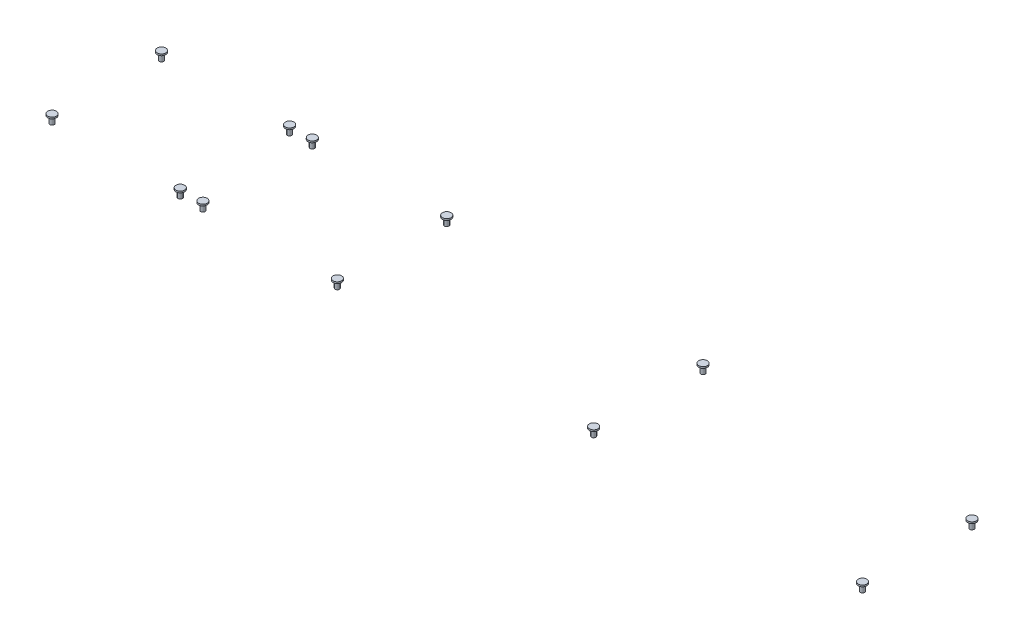
ISO-10303-21;
HEADER;
FILE_DESCRIPTION(('STEP AP214'),'2;1');
FILE_NAME('part.step','',(''),(''),'','','');
FILE_SCHEMA(('AUTOMOTIVE_DESIGN { 1 0 10303 214 1 1 1 1 }'));
ENDSEC;
DATA;
#1=APPLICATION_CONTEXT('core data for automotive mechanical design processes');
#2=APPLICATION_PROTOCOL_DEFINITION('international standard','automotive_design',2000,#1);
#3=PRODUCT_CONTEXT('',#1,'mechanical');
#4=PRODUCT('Part','Part','',(#3));
#5=PRODUCT_RELATED_PRODUCT_CATEGORY('part','',(#4));
#6=PRODUCT_DEFINITION_FORMATION('','',#4);
#7=PRODUCT_DEFINITION_CONTEXT('part definition',#1,'design');
#8=PRODUCT_DEFINITION('design','',#6,#7);
#9=PRODUCT_DEFINITION_SHAPE('','',#8);
#10=(LENGTH_UNIT() NAMED_UNIT(*) SI_UNIT(.MILLI.,.METRE.));
#11=(NAMED_UNIT(*) PLANE_ANGLE_UNIT() SI_UNIT($,.RADIAN.));
#12=(NAMED_UNIT(*) SI_UNIT($,.STERADIAN.) SOLID_ANGLE_UNIT());
#13=UNCERTAINTY_MEASURE_WITH_UNIT(LENGTH_MEASURE(1.E-05),#10,'distance_accuracy_value','');
#14=(GEOMETRIC_REPRESENTATION_CONTEXT(3) GLOBAL_UNCERTAINTY_ASSIGNED_CONTEXT((#13)) GLOBAL_UNIT_ASSIGNED_CONTEXT((#10,
#11,#12)) REPRESENTATION_CONTEXT('',''));
#15=CARTESIAN_POINT('',(0.,0.,0.));
#16=DIRECTION('',(0.,0.,1.));
#17=DIRECTION('',(1.,0.,0.));
#18=AXIS2_PLACEMENT_3D('',#15,#16,#17);
#19=CARTESIAN_POINT('',(-259.5,207.8,20.));
#20=DIRECTION('',(0.,-1.,0.));
#21=DIRECTION('',(0.,0.,-1.));
#22=AXIS2_PLACEMENT_3D('',#19,#20,#21);
#23=PLANE('',#22);
#24=CARTESIAN_POINT('',(-259.5,207.8,20.));
#25=DIRECTION('',(0.,1.,0.));
#26=DIRECTION('',(0.,0.,1.));
#27=AXIS2_PLACEMENT_3D('',#24,#25,#26);
#28=CIRCLE('',#27,1.4);
#29=CARTESIAN_POINT('',(-259.5,207.8,21.4));
#30=VERTEX_POINT('',#29);
#31=EDGE_CURVE('P0_E23',#30,#30,#28,.T.);
#32=ORIENTED_EDGE('',*,*,#31,.F.);
#33=EDGE_LOOP('',(#32));
#34=FACE_BOUND('',#33,.T.);
#35=ADVANCED_FACE('P0_F15',(#34),#23,.T.);
#36=CARTESIAN_POINT('',(-259.5,207.8,20.));
#37=DIRECTION('',(0.,1.,0.));
#38=DIRECTION('',(0.,0.,1.));
#39=AXIS2_PLACEMENT_3D('',#36,#37,#38);
#40=CYLINDRICAL_SURFACE('',#39,1.4);
#41=CARTESIAN_POINT('',(-259.5,212.2,20.));
#42=DIRECTION('',(0.,-1.,0.));
#43=DIRECTION('',(0.,0.,-1.));
#44=AXIS2_PLACEMENT_3D('',#41,#42,#43);
#45=CIRCLE('',#44,1.4);
#46=CARTESIAN_POINT('',(-259.5,212.2,18.6));
#47=VERTEX_POINT('',#46);
#48=EDGE_CURVE('P0_E10',#47,#47,#45,.F.);
#49=ORIENTED_EDGE('',*,*,#48,.F.);
#50=EDGE_LOOP('',(#49));
#51=FACE_BOUND('',#50,.T.);
#52=ORIENTED_EDGE('',*,*,#31,.T.);
#53=EDGE_LOOP('',(#52));
#54=FACE_BOUND('',#53,.T.);
#55=ADVANCED_FACE('P0_F17',(#51,#54),#40,.T.);
#56=CARTESIAN_POINT('',(-259.5,212.2,20.));
#57=DIRECTION('',(0.,-1.,0.));
#58=DIRECTION('',(0.,0.,-1.));
#59=AXIS2_PLACEMENT_3D('',#56,#57,#58);
#60=PLANE('',#59);
#61=ORIENTED_EDGE('',*,*,#48,.T.);
#62=EDGE_LOOP('',(#61));
#63=FACE_BOUND('',#62,.T.);
#64=CARTESIAN_POINT('',(-259.5,212.2,20.));
#65=DIRECTION('',(0.,1.,0.));
#66=DIRECTION('',(0.,0.,1.));
#67=AXIS2_PLACEMENT_3D('',#64,#65,#66);
#68=CIRCLE('',#67,2.75);
#69=CARTESIAN_POINT('',(-259.5,212.2,22.75));
#70=VERTEX_POINT('',#69);
#71=EDGE_CURVE('P0_E35',#70,#70,#68,.T.);
#72=ORIENTED_EDGE('',*,*,#71,.F.);
#73=EDGE_LOOP('',(#72));
#74=FACE_BOUND('',#73,.T.);
#75=ADVANCED_FACE('P0_F43',(#63,#74),#60,.T.);
#76=CARTESIAN_POINT('',(-259.5,212.2,20.));
#77=DIRECTION('',(0.,1.,0.));
#78=DIRECTION('',(0.,0.,1.));
#79=AXIS2_PLACEMENT_3D('',#76,#77,#78);
#80=CYLINDRICAL_SURFACE('',#79,2.75);
#81=CARTESIAN_POINT('',(-259.5,213.2,20.));
#82=DIRECTION('',(0.,-1.,0.));
#83=DIRECTION('',(0.,0.,-1.));
#84=AXIS2_PLACEMENT_3D('',#81,#82,#83);
#85=CIRCLE('',#84,2.75);
#86=CARTESIAN_POINT('',(-259.5,213.2,17.25));
#87=VERTEX_POINT('',#86);
#88=EDGE_CURVE('P0_E30',#87,#87,#85,.T.);
#89=ORIENTED_EDGE('',*,*,#88,.T.);
#90=EDGE_LOOP('',(#89));
#91=FACE_BOUND('',#90,.T.);
#92=ORIENTED_EDGE('',*,*,#71,.T.);
#93=EDGE_LOOP('',(#92));
#94=FACE_BOUND('',#93,.T.);
#95=ADVANCED_FACE('P0_F41',(#91,#94),#80,.T.);
#96=CARTESIAN_POINT('',(-259.5,213.2,20.));
#97=DIRECTION('',(0.,1.,0.));
#98=DIRECTION('',(0.,0.,1.));
#99=AXIS2_PLACEMENT_3D('',#96,#97,#98);
#100=PLANE('',#99);
#101=ORIENTED_EDGE('',*,*,#88,.F.);
#102=EDGE_LOOP('',(#101));
#103=FACE_BOUND('',#102,.T.);
#104=ADVANCED_FACE('P0_F50',(#103),#100,.T.);
#105=CLOSED_SHELL('',(#35,#55,#75,#95,#104));
#106=MANIFOLD_SOLID_BREP('P0_B1',#105);
#107=CARTESIAN_POINT('',(87.,207.8,90.));
#108=DIRECTION('',(0.,-1.,0.));
#109=DIRECTION('',(0.,0.,-1.));
#110=AXIS2_PLACEMENT_3D('',#107,#108,#109);
#111=PLANE('',#110);
#112=CARTESIAN_POINT('',(87.,207.8,90.));
#113=DIRECTION('',(0.,1.,0.));
#114=DIRECTION('',(0.,0.,1.));
#115=AXIS2_PLACEMENT_3D('',#112,#113,#114);
#116=CIRCLE('',#115,1.4);
#117=CARTESIAN_POINT('',(87.,207.8,91.4));
#118=VERTEX_POINT('',#117);
#119=EDGE_CURVE('P1_E23',#118,#118,#116,.T.);
#120=ORIENTED_EDGE('',*,*,#119,.F.);
#121=EDGE_LOOP('',(#120));
#122=FACE_BOUND('',#121,.T.);
#123=ADVANCED_FACE('P1_F15',(#122),#111,.T.);
#124=CARTESIAN_POINT('',(87.,207.8,90.));
#125=DIRECTION('',(0.,1.,0.));
#126=DIRECTION('',(0.,0.,1.));
#127=AXIS2_PLACEMENT_3D('',#124,#125,#126);
#128=CYLINDRICAL_SURFACE('',#127,1.4);
#129=CARTESIAN_POINT('',(87.,212.2,90.));
#130=DIRECTION('',(0.,-1.,0.));
#131=DIRECTION('',(0.,0.,-1.));
#132=AXIS2_PLACEMENT_3D('',#129,#130,#131);
#133=CIRCLE('',#132,1.4);
#134=CARTESIAN_POINT('',(87.,212.2,88.6));
#135=VERTEX_POINT('',#134);
#136=EDGE_CURVE('P1_E10',#135,#135,#133,.F.);
#137=ORIENTED_EDGE('',*,*,#136,.F.);
#138=EDGE_LOOP('',(#137));
#139=FACE_BOUND('',#138,.T.);
#140=ORIENTED_EDGE('',*,*,#119,.T.);
#141=EDGE_LOOP('',(#140));
#142=FACE_BOUND('',#141,.T.);
#143=ADVANCED_FACE('P1_F17',(#139,#142),#128,.T.);
#144=CARTESIAN_POINT('',(87.,212.2,90.));
#145=DIRECTION('',(0.,-1.,0.));
#146=DIRECTION('',(0.,0.,-1.));
#147=AXIS2_PLACEMENT_3D('',#144,#145,#146);
#148=PLANE('',#147);
#149=ORIENTED_EDGE('',*,*,#136,.T.);
#150=EDGE_LOOP('',(#149));
#151=FACE_BOUND('',#150,.T.);
#152=CARTESIAN_POINT('',(87.,212.2,90.));
#153=DIRECTION('',(0.,1.,0.));
#154=DIRECTION('',(0.,0.,1.));
#155=AXIS2_PLACEMENT_3D('',#152,#153,#154);
#156=CIRCLE('',#155,2.75);
#157=CARTESIAN_POINT('',(87.,212.2,92.75));
#158=VERTEX_POINT('',#157);
#159=EDGE_CURVE('P1_E35',#158,#158,#156,.T.);
#160=ORIENTED_EDGE('',*,*,#159,.F.);
#161=EDGE_LOOP('',(#160));
#162=FACE_BOUND('',#161,.T.);
#163=ADVANCED_FACE('P1_F43',(#151,#162),#148,.T.);
#164=CARTESIAN_POINT('',(87.,212.2,90.));
#165=DIRECTION('',(0.,1.,0.));
#166=DIRECTION('',(0.,0.,1.));
#167=AXIS2_PLACEMENT_3D('',#164,#165,#166);
#168=CYLINDRICAL_SURFACE('',#167,2.75);
#169=CARTESIAN_POINT('',(87.,213.2,90.));
#170=DIRECTION('',(0.,-1.,0.));
#171=DIRECTION('',(0.,0.,-1.));
#172=AXIS2_PLACEMENT_3D('',#169,#170,#171);
#173=CIRCLE('',#172,2.75);
#174=CARTESIAN_POINT('',(87.,213.2,87.25));
#175=VERTEX_POINT('',#174);
#176=EDGE_CURVE('P1_E31',#175,#175,#173,.T.);
#177=ORIENTED_EDGE('',*,*,#176,.T.);
#178=EDGE_LOOP('',(#177));
#179=FACE_BOUND('',#178,.T.);
#180=ORIENTED_EDGE('',*,*,#159,.T.);
#181=EDGE_LOOP('',(#180));
#182=FACE_BOUND('',#181,.T.);
#183=ADVANCED_FACE('P1_F41',(#179,#182),#168,.T.);
#184=CARTESIAN_POINT('',(87.,213.2,90.));
#185=DIRECTION('',(0.,1.,0.));
#186=DIRECTION('',(0.,0.,1.));
#187=AXIS2_PLACEMENT_3D('',#184,#185,#186);
#188=PLANE('',#187);
#189=ORIENTED_EDGE('',*,*,#176,.F.);
#190=EDGE_LOOP('',(#189));
#191=FACE_BOUND('',#190,.T.);
#192=ADVANCED_FACE('P1_F50',(#191),#188,.T.);
#193=CLOSED_SHELL('',(#123,#143,#163,#183,#192));
#194=MANIFOLD_SOLID_BREP('P1_B1',#193);
#195=CARTESIAN_POINT('',(259.,207.8,20.));
#196=DIRECTION('',(0.,-1.,0.));
#197=DIRECTION('',(0.,0.,-1.));
#198=AXIS2_PLACEMENT_3D('',#195,#196,#197);
#199=PLANE('',#198);
#200=CARTESIAN_POINT('',(259.,207.8,20.));
#201=DIRECTION('',(0.,1.,0.));
#202=DIRECTION('',(0.,0.,1.));
#203=AXIS2_PLACEMENT_3D('',#200,#201,#202);
#204=CIRCLE('',#203,1.4);
#205=CARTESIAN_POINT('',(259.,207.8,21.4));
#206=VERTEX_POINT('',#205);
#207=EDGE_CURVE('P2_E23',#206,#206,#204,.T.);
#208=ORIENTED_EDGE('',*,*,#207,.F.);
#209=EDGE_LOOP('',(#208));
#210=FACE_BOUND('',#209,.T.);
#211=ADVANCED_FACE('P2_F15',(#210),#199,.T.);
#212=CARTESIAN_POINT('',(259.,207.8,20.));
#213=DIRECTION('',(0.,1.,0.));
#214=DIRECTION('',(0.,0.,1.));
#215=AXIS2_PLACEMENT_3D('',#212,#213,#214);
#216=CYLINDRICAL_SURFACE('',#215,1.4);
#217=CARTESIAN_POINT('',(259.,212.2,20.));
#218=DIRECTION('',(0.,-1.,0.));
#219=DIRECTION('',(0.,0.,-1.));
#220=AXIS2_PLACEMENT_3D('',#217,#218,#219);
#221=CIRCLE('',#220,1.4);
#222=CARTESIAN_POINT('',(259.,212.2,18.6));
#223=VERTEX_POINT('',#222);
#224=EDGE_CURVE('P2_E10',#223,#223,#221,.F.);
#225=ORIENTED_EDGE('',*,*,#224,.F.);
#226=EDGE_LOOP('',(#225));
#227=FACE_BOUND('',#226,.T.);
#228=ORIENTED_EDGE('',*,*,#207,.T.);
#229=EDGE_LOOP('',(#228));
#230=FACE_BOUND('',#229,.T.);
#231=ADVANCED_FACE('P2_F17',(#227,#230),#216,.T.);
#232=CARTESIAN_POINT('',(259.,212.2,20.));
#233=DIRECTION('',(0.,-1.,0.));
#234=DIRECTION('',(0.,0.,-1.));
#235=AXIS2_PLACEMENT_3D('',#232,#233,#234);
#236=PLANE('',#235);
#237=ORIENTED_EDGE('',*,*,#224,.T.);
#238=EDGE_LOOP('',(#237));
#239=FACE_BOUND('',#238,.T.);
#240=CARTESIAN_POINT('',(259.,212.2,20.));
#241=DIRECTION('',(0.,1.,0.));
#242=DIRECTION('',(0.,0.,1.));
#243=AXIS2_PLACEMENT_3D('',#240,#241,#242);
#244=CIRCLE('',#243,2.75);
#245=CARTESIAN_POINT('',(259.,212.2,22.75));
#246=VERTEX_POINT('',#245);
#247=EDGE_CURVE('P2_E35',#246,#246,#244,.T.);
#248=ORIENTED_EDGE('',*,*,#247,.F.);
#249=EDGE_LOOP('',(#248));
#250=FACE_BOUND('',#249,.T.);
#251=ADVANCED_FACE('P2_F43',(#239,#250),#236,.T.);
#252=CARTESIAN_POINT('',(259.,212.2,20.));
#253=DIRECTION('',(0.,1.,0.));
#254=DIRECTION('',(0.,0.,1.));
#255=AXIS2_PLACEMENT_3D('',#252,#253,#254);
#256=CYLINDRICAL_SURFACE('',#255,2.75);
#257=CARTESIAN_POINT('',(259.,213.2,20.));
#258=DIRECTION('',(0.,-1.,0.));
#259=DIRECTION('',(0.,0.,-1.));
#260=AXIS2_PLACEMENT_3D('',#257,#258,#259);
#261=CIRCLE('',#260,2.75);
#262=CARTESIAN_POINT('',(259.,213.2,17.25));
#263=VERTEX_POINT('',#262);
#264=EDGE_CURVE('P2_E31',#263,#263,#261,.T.);
#265=ORIENTED_EDGE('',*,*,#264,.T.);
#266=EDGE_LOOP('',(#265));
#267=FACE_BOUND('',#266,.T.);
#268=ORIENTED_EDGE('',*,*,#247,.T.);
#269=EDGE_LOOP('',(#268));
#270=FACE_BOUND('',#269,.T.);
#271=ADVANCED_FACE('P2_F41',(#267,#270),#256,.T.);
#272=CARTESIAN_POINT('',(259.,213.2,20.));
#273=DIRECTION('',(0.,1.,0.));
#274=DIRECTION('',(0.,0.,1.));
#275=AXIS2_PLACEMENT_3D('',#272,#273,#274);
#276=PLANE('',#275);
#277=ORIENTED_EDGE('',*,*,#264,.F.);
#278=EDGE_LOOP('',(#277));
#279=FACE_BOUND('',#278,.T.);
#280=ADVANCED_FACE('P2_F50',(#279),#276,.T.);
#281=CLOSED_SHELL('',(#211,#231,#251,#271,#280));
#282=MANIFOLD_SOLID_BREP('P2_B1',#281);
#283=CARTESIAN_POINT('',(259.,207.8,90.));
#284=DIRECTION('',(0.,-1.,0.));
#285=DIRECTION('',(0.,0.,-1.));
#286=AXIS2_PLACEMENT_3D('',#283,#284,#285);
#287=PLANE('',#286);
#288=CARTESIAN_POINT('',(259.,207.8,90.));
#289=DIRECTION('',(0.,1.,0.));
#290=DIRECTION('',(0.,0.,1.));
#291=AXIS2_PLACEMENT_3D('',#288,#289,#290);
#292=CIRCLE('',#291,1.4);
#293=CARTESIAN_POINT('',(259.,207.8,91.4));
#294=VERTEX_POINT('',#293);
#295=EDGE_CURVE('P3_E23',#294,#294,#292,.T.);
#296=ORIENTED_EDGE('',*,*,#295,.F.);
#297=EDGE_LOOP('',(#296));
#298=FACE_BOUND('',#297,.T.);
#299=ADVANCED_FACE('P3_F15',(#298),#287,.T.);
#300=CARTESIAN_POINT('',(259.,207.8,90.));
#301=DIRECTION('',(0.,1.,0.));
#302=DIRECTION('',(0.,0.,1.));
#303=AXIS2_PLACEMENT_3D('',#300,#301,#302);
#304=CYLINDRICAL_SURFACE('',#303,1.4);
#305=CARTESIAN_POINT('',(259.,212.2,90.));
#306=DIRECTION('',(0.,-1.,0.));
#307=DIRECTION('',(0.,0.,-1.));
#308=AXIS2_PLACEMENT_3D('',#305,#306,#307);
#309=CIRCLE('',#308,1.4);
#310=CARTESIAN_POINT('',(259.,212.2,88.6));
#311=VERTEX_POINT('',#310);
#312=EDGE_CURVE('P3_E10',#311,#311,#309,.F.);
#313=ORIENTED_EDGE('',*,*,#312,.F.);
#314=EDGE_LOOP('',(#313));
#315=FACE_BOUND('',#314,.T.);
#316=ORIENTED_EDGE('',*,*,#295,.T.);
#317=EDGE_LOOP('',(#316));
#318=FACE_BOUND('',#317,.T.);
#319=ADVANCED_FACE('P3_F17',(#315,#318),#304,.T.);
#320=CARTESIAN_POINT('',(259.,212.2,90.));
#321=DIRECTION('',(0.,-1.,0.));
#322=DIRECTION('',(0.,0.,-1.));
#323=AXIS2_PLACEMENT_3D('',#320,#321,#322);
#324=PLANE('',#323);
#325=ORIENTED_EDGE('',*,*,#312,.T.);
#326=EDGE_LOOP('',(#325));
#327=FACE_BOUND('',#326,.T.);
#328=CARTESIAN_POINT('',(259.,212.2,90.));
#329=DIRECTION('',(0.,1.,0.));
#330=DIRECTION('',(0.,0.,1.));
#331=AXIS2_PLACEMENT_3D('',#328,#329,#330);
#332=CIRCLE('',#331,2.75);
#333=CARTESIAN_POINT('',(259.,212.2,92.75));
#334=VERTEX_POINT('',#333);
#335=EDGE_CURVE('P3_E35',#334,#334,#332,.T.);
#336=ORIENTED_EDGE('',*,*,#335,.F.);
#337=EDGE_LOOP('',(#336));
#338=FACE_BOUND('',#337,.T.);
#339=ADVANCED_FACE('P3_F43',(#327,#338),#324,.T.);
#340=CARTESIAN_POINT('',(259.,212.2,90.));
#341=DIRECTION('',(0.,1.,0.));
#342=DIRECTION('',(0.,0.,1.));
#343=AXIS2_PLACEMENT_3D('',#340,#341,#342);
#344=CYLINDRICAL_SURFACE('',#343,2.75);
#345=CARTESIAN_POINT('',(259.,213.2,90.));
#346=DIRECTION('',(0.,-1.,0.));
#347=DIRECTION('',(0.,0.,-1.));
#348=AXIS2_PLACEMENT_3D('',#345,#346,#347);
#349=CIRCLE('',#348,2.75);
#350=CARTESIAN_POINT('',(259.,213.2,87.25));
#351=VERTEX_POINT('',#350);
#352=EDGE_CURVE('P3_E31',#351,#351,#349,.T.);
#353=ORIENTED_EDGE('',*,*,#352,.T.);
#354=EDGE_LOOP('',(#353));
#355=FACE_BOUND('',#354,.T.);
#356=ORIENTED_EDGE('',*,*,#335,.T.);
#357=EDGE_LOOP('',(#356));
#358=FACE_BOUND('',#357,.T.);
#359=ADVANCED_FACE('P3_F41',(#355,#358),#344,.T.);
#360=CARTESIAN_POINT('',(259.,213.2,90.));
#361=DIRECTION('',(0.,1.,0.));
#362=DIRECTION('',(0.,0.,1.));
#363=AXIS2_PLACEMENT_3D('',#360,#361,#362);
#364=PLANE('',#363);
#365=ORIENTED_EDGE('',*,*,#352,.F.);
#366=EDGE_LOOP('',(#365));
#367=FACE_BOUND('',#366,.T.);
#368=ADVANCED_FACE('P3_F50',(#367),#364,.T.);
#369=CLOSED_SHELL('',(#299,#319,#339,#359,#368));
#370=MANIFOLD_SOLID_BREP('P3_B1',#369);
#371=CARTESIAN_POINT('',(-259.5,207.8,90.));
#372=DIRECTION('',(0.,-1.,0.));
#373=DIRECTION('',(0.,0.,-1.));
#374=AXIS2_PLACEMENT_3D('',#371,#372,#373);
#375=PLANE('',#374);
#376=CARTESIAN_POINT('',(-259.5,207.8,90.));
#377=DIRECTION('',(0.,1.,0.));
#378=DIRECTION('',(0.,0.,1.));
#379=AXIS2_PLACEMENT_3D('',#376,#377,#378);
#380=CIRCLE('',#379,1.4);
#381=CARTESIAN_POINT('',(-259.5,207.8,91.4));
#382=VERTEX_POINT('',#381);
#383=EDGE_CURVE('P4_E23',#382,#382,#380,.T.);
#384=ORIENTED_EDGE('',*,*,#383,.F.);
#385=EDGE_LOOP('',(#384));
#386=FACE_BOUND('',#385,.T.);
#387=ADVANCED_FACE('P4_F15',(#386),#375,.T.);
#388=CARTESIAN_POINT('',(-259.5,207.8,90.));
#389=DIRECTION('',(0.,1.,0.));
#390=DIRECTION('',(0.,0.,1.));
#391=AXIS2_PLACEMENT_3D('',#388,#389,#390);
#392=CYLINDRICAL_SURFACE('',#391,1.4);
#393=CARTESIAN_POINT('',(-259.5,212.2,90.));
#394=DIRECTION('',(0.,-1.,0.));
#395=DIRECTION('',(0.,0.,-1.));
#396=AXIS2_PLACEMENT_3D('',#393,#394,#395);
#397=CIRCLE('',#396,1.4);
#398=CARTESIAN_POINT('',(-259.5,212.2,88.6));
#399=VERTEX_POINT('',#398);
#400=EDGE_CURVE('P4_E10',#399,#399,#397,.F.);
#401=ORIENTED_EDGE('',*,*,#400,.F.);
#402=EDGE_LOOP('',(#401));
#403=FACE_BOUND('',#402,.T.);
#404=ORIENTED_EDGE('',*,*,#383,.T.);
#405=EDGE_LOOP('',(#404));
#406=FACE_BOUND('',#405,.T.);
#407=ADVANCED_FACE('P4_F17',(#403,#406),#392,.T.);
#408=CARTESIAN_POINT('',(-259.5,212.2,90.));
#409=DIRECTION('',(0.,-1.,0.));
#410=DIRECTION('',(0.,0.,-1.));
#411=AXIS2_PLACEMENT_3D('',#408,#409,#410);
#412=PLANE('',#411);
#413=ORIENTED_EDGE('',*,*,#400,.T.);
#414=EDGE_LOOP('',(#413));
#415=FACE_BOUND('',#414,.T.);
#416=CARTESIAN_POINT('',(-259.5,212.2,90.));
#417=DIRECTION('',(0.,1.,0.));
#418=DIRECTION('',(0.,0.,1.));
#419=AXIS2_PLACEMENT_3D('',#416,#417,#418);
#420=CIRCLE('',#419,2.75);
#421=CARTESIAN_POINT('',(-259.5,212.2,92.75));
#422=VERTEX_POINT('',#421);
#423=EDGE_CURVE('P4_E35',#422,#422,#420,.T.);
#424=ORIENTED_EDGE('',*,*,#423,.F.);
#425=EDGE_LOOP('',(#424));
#426=FACE_BOUND('',#425,.T.);
#427=ADVANCED_FACE('P4_F43',(#415,#426),#412,.T.);
#428=CARTESIAN_POINT('',(-259.5,212.2,90.));
#429=DIRECTION('',(0.,1.,0.));
#430=DIRECTION('',(0.,0.,1.));
#431=AXIS2_PLACEMENT_3D('',#428,#429,#430);
#432=CYLINDRICAL_SURFACE('',#431,2.75);
#433=CARTESIAN_POINT('',(-259.5,213.2,90.));
#434=DIRECTION('',(0.,-1.,0.));
#435=DIRECTION('',(0.,0.,-1.));
#436=AXIS2_PLACEMENT_3D('',#433,#434,#435);
#437=CIRCLE('',#436,2.75);
#438=CARTESIAN_POINT('',(-259.5,213.2,87.25));
#439=VERTEX_POINT('',#438);
#440=EDGE_CURVE('P4_E30',#439,#439,#437,.T.);
#441=ORIENTED_EDGE('',*,*,#440,.T.);
#442=EDGE_LOOP('',(#441));
#443=FACE_BOUND('',#442,.T.);
#444=ORIENTED_EDGE('',*,*,#423,.T.);
#445=EDGE_LOOP('',(#444));
#446=FACE_BOUND('',#445,.T.);
#447=ADVANCED_FACE('P4_F41',(#443,#446),#432,.T.);
#448=CARTESIAN_POINT('',(-259.5,213.2,90.));
#449=DIRECTION('',(0.,1.,0.));
#450=DIRECTION('',(0.,0.,1.));
#451=AXIS2_PLACEMENT_3D('',#448,#449,#450);
#452=PLANE('',#451);
#453=ORIENTED_EDGE('',*,*,#440,.F.);
#454=EDGE_LOOP('',(#453));
#455=FACE_BOUND('',#454,.T.);
#456=ADVANCED_FACE('P4_F50',(#455),#452,.T.);
#457=CLOSED_SHELL('',(#387,#407,#427,#447,#456));
#458=MANIFOLD_SOLID_BREP('P4_B1',#457);
#459=CARTESIAN_POINT('',(-177.5,207.8,20.));
#460=DIRECTION('',(0.,-1.,0.));
#461=DIRECTION('',(0.,0.,-1.));
#462=AXIS2_PLACEMENT_3D('',#459,#460,#461);
#463=PLANE('',#462);
#464=CARTESIAN_POINT('',(-177.5,207.8,20.));
#465=DIRECTION('',(0.,1.,0.));
#466=DIRECTION('',(0.,0.,1.));
#467=AXIS2_PLACEMENT_3D('',#464,#465,#466);
#468=CIRCLE('',#467,1.4);
#469=CARTESIAN_POINT('',(-177.5,207.8,21.4));
#470=VERTEX_POINT('',#469);
#471=EDGE_CURVE('P5_E23',#470,#470,#468,.T.);
#472=ORIENTED_EDGE('',*,*,#471,.F.);
#473=EDGE_LOOP('',(#472));
#474=FACE_BOUND('',#473,.T.);
#475=ADVANCED_FACE('P5_F15',(#474),#463,.T.);
#476=CARTESIAN_POINT('',(-177.5,207.8,20.));
#477=DIRECTION('',(0.,1.,0.));
#478=DIRECTION('',(0.,0.,1.));
#479=AXIS2_PLACEMENT_3D('',#476,#477,#478);
#480=CYLINDRICAL_SURFACE('',#479,1.4);
#481=CARTESIAN_POINT('',(-177.5,212.2,20.));
#482=DIRECTION('',(0.,-1.,0.));
#483=DIRECTION('',(0.,0.,-1.));
#484=AXIS2_PLACEMENT_3D('',#481,#482,#483);
#485=CIRCLE('',#484,1.4);
#486=CARTESIAN_POINT('',(-177.5,212.2,18.6));
#487=VERTEX_POINT('',#486);
#488=EDGE_CURVE('P5_E10',#487,#487,#485,.F.);
#489=ORIENTED_EDGE('',*,*,#488,.F.);
#490=EDGE_LOOP('',(#489));
#491=FACE_BOUND('',#490,.T.);
#492=ORIENTED_EDGE('',*,*,#471,.T.);
#493=EDGE_LOOP('',(#492));
#494=FACE_BOUND('',#493,.T.);
#495=ADVANCED_FACE('P5_F17',(#491,#494),#480,.T.);
#496=CARTESIAN_POINT('',(-177.5,212.2,20.));
#497=DIRECTION('',(0.,-1.,0.));
#498=DIRECTION('',(0.,0.,-1.));
#499=AXIS2_PLACEMENT_3D('',#496,#497,#498);
#500=PLANE('',#499);
#501=ORIENTED_EDGE('',*,*,#488,.T.);
#502=EDGE_LOOP('',(#501));
#503=FACE_BOUND('',#502,.T.);
#504=CARTESIAN_POINT('',(-177.5,212.2,20.));
#505=DIRECTION('',(0.,1.,0.));
#506=DIRECTION('',(0.,0.,1.));
#507=AXIS2_PLACEMENT_3D('',#504,#505,#506);
#508=CIRCLE('',#507,2.75);
#509=CARTESIAN_POINT('',(-177.5,212.2,22.75));
#510=VERTEX_POINT('',#509);
#511=EDGE_CURVE('P5_E34',#510,#510,#508,.T.);
#512=ORIENTED_EDGE('',*,*,#511,.F.);
#513=EDGE_LOOP('',(#512));
#514=FACE_BOUND('',#513,.T.);
#515=ADVANCED_FACE('P5_F43',(#503,#514),#500,.T.);
#516=CARTESIAN_POINT('',(-177.5,212.2,20.));
#517=DIRECTION('',(0.,1.,0.));
#518=DIRECTION('',(0.,0.,1.));
#519=AXIS2_PLACEMENT_3D('',#516,#517,#518);
#520=CYLINDRICAL_SURFACE('',#519,2.75);
#521=CARTESIAN_POINT('',(-177.5,213.2,20.));
#522=DIRECTION('',(0.,-1.,0.));
#523=DIRECTION('',(0.,0.,-1.));
#524=AXIS2_PLACEMENT_3D('',#521,#522,#523);
#525=CIRCLE('',#524,2.75);
#526=CARTESIAN_POINT('',(-177.5,213.2,17.25));
#527=VERTEX_POINT('',#526);
#528=EDGE_CURVE('P5_E30',#527,#527,#525,.T.);
#529=ORIENTED_EDGE('',*,*,#528,.T.);
#530=EDGE_LOOP('',(#529));
#531=FACE_BOUND('',#530,.T.);
#532=ORIENTED_EDGE('',*,*,#511,.T.);
#533=EDGE_LOOP('',(#532));
#534=FACE_BOUND('',#533,.T.);
#535=ADVANCED_FACE('P5_F41',(#531,#534),#520,.T.);
#536=CARTESIAN_POINT('',(-177.5,213.2,20.));
#537=DIRECTION('',(0.,1.,0.));
#538=DIRECTION('',(0.,0.,1.));
#539=AXIS2_PLACEMENT_3D('',#536,#537,#538);
#540=PLANE('',#539);
#541=ORIENTED_EDGE('',*,*,#528,.F.);
#542=EDGE_LOOP('',(#541));
#543=FACE_BOUND('',#542,.T.);
#544=ADVANCED_FACE('P5_F50',(#543),#540,.T.);
#545=CLOSED_SHELL('',(#475,#495,#515,#535,#544));
#546=MANIFOLD_SOLID_BREP('P5_B1',#545);
#547=CARTESIAN_POINT('',(-177.5,207.8,90.));
#548=DIRECTION('',(0.,-1.,0.));
#549=DIRECTION('',(0.,0.,-1.));
#550=AXIS2_PLACEMENT_3D('',#547,#548,#549);
#551=PLANE('',#550);
#552=CARTESIAN_POINT('',(-177.5,207.8,90.));
#553=DIRECTION('',(0.,1.,0.));
#554=DIRECTION('',(0.,0.,1.));
#555=AXIS2_PLACEMENT_3D('',#552,#553,#554);
#556=CIRCLE('',#555,1.4);
#557=CARTESIAN_POINT('',(-177.5,207.8,91.4));
#558=VERTEX_POINT('',#557);
#559=EDGE_CURVE('P6_E23',#558,#558,#556,.T.);
#560=ORIENTED_EDGE('',*,*,#559,.F.);
#561=EDGE_LOOP('',(#560));
#562=FACE_BOUND('',#561,.T.);
#563=ADVANCED_FACE('P6_F15',(#562),#551,.T.);
#564=CARTESIAN_POINT('',(-177.5,207.8,90.));
#565=DIRECTION('',(0.,1.,0.));
#566=DIRECTION('',(0.,0.,1.));
#567=AXIS2_PLACEMENT_3D('',#564,#565,#566);
#568=CYLINDRICAL_SURFACE('',#567,1.4);
#569=CARTESIAN_POINT('',(-177.5,212.2,90.));
#570=DIRECTION('',(0.,-1.,0.));
#571=DIRECTION('',(0.,0.,-1.));
#572=AXIS2_PLACEMENT_3D('',#569,#570,#571);
#573=CIRCLE('',#572,1.4);
#574=CARTESIAN_POINT('',(-177.5,212.2,88.6));
#575=VERTEX_POINT('',#574);
#576=EDGE_CURVE('P6_E10',#575,#575,#573,.F.);
#577=ORIENTED_EDGE('',*,*,#576,.F.);
#578=EDGE_LOOP('',(#577));
#579=FACE_BOUND('',#578,.T.);
#580=ORIENTED_EDGE('',*,*,#559,.T.);
#581=EDGE_LOOP('',(#580));
#582=FACE_BOUND('',#581,.T.);
#583=ADVANCED_FACE('P6_F17',(#579,#582),#568,.T.);
#584=CARTESIAN_POINT('',(-177.5,212.2,90.));
#585=DIRECTION('',(0.,-1.,0.));
#586=DIRECTION('',(0.,0.,-1.));
#587=AXIS2_PLACEMENT_3D('',#584,#585,#586);
#588=PLANE('',#587);
#589=ORIENTED_EDGE('',*,*,#576,.T.);
#590=EDGE_LOOP('',(#589));
#591=FACE_BOUND('',#590,.T.);
#592=CARTESIAN_POINT('',(-177.5,212.2,90.));
#593=DIRECTION('',(0.,1.,0.));
#594=DIRECTION('',(0.,0.,1.));
#595=AXIS2_PLACEMENT_3D('',#592,#593,#594);
#596=CIRCLE('',#595,2.75);
#597=CARTESIAN_POINT('',(-177.5,212.2,92.75));
#598=VERTEX_POINT('',#597);
#599=EDGE_CURVE('P6_E35',#598,#598,#596,.T.);
#600=ORIENTED_EDGE('',*,*,#599,.F.);
#601=EDGE_LOOP('',(#600));
#602=FACE_BOUND('',#601,.T.);
#603=ADVANCED_FACE('P6_F43',(#591,#602),#588,.T.);
#604=CARTESIAN_POINT('',(-177.5,212.2,90.));
#605=DIRECTION('',(0.,1.,0.));
#606=DIRECTION('',(0.,0.,1.));
#607=AXIS2_PLACEMENT_3D('',#604,#605,#606);
#608=CYLINDRICAL_SURFACE('',#607,2.75);
#609=CARTESIAN_POINT('',(-177.5,213.2,90.));
#610=DIRECTION('',(0.,-1.,0.));
#611=DIRECTION('',(0.,0.,-1.));
#612=AXIS2_PLACEMENT_3D('',#609,#610,#611);
#613=CIRCLE('',#612,2.75);
#614=CARTESIAN_POINT('',(-177.5,213.2,87.25));
#615=VERTEX_POINT('',#614);
#616=EDGE_CURVE('P6_E30',#615,#615,#613,.T.);
#617=ORIENTED_EDGE('',*,*,#616,.T.);
#618=EDGE_LOOP('',(#617));
#619=FACE_BOUND('',#618,.T.);
#620=ORIENTED_EDGE('',*,*,#599,.T.);
#621=EDGE_LOOP('',(#620));
#622=FACE_BOUND('',#621,.T.);
#623=ADVANCED_FACE('P6_F41',(#619,#622),#608,.T.);
#624=CARTESIAN_POINT('',(-177.5,213.2,90.));
#625=DIRECTION('',(0.,1.,0.));
#626=DIRECTION('',(0.,0.,1.));
#627=AXIS2_PLACEMENT_3D('',#624,#625,#626);
#628=PLANE('',#627);
#629=ORIENTED_EDGE('',*,*,#616,.F.);
#630=EDGE_LOOP('',(#629));
#631=FACE_BOUND('',#630,.T.);
#632=ADVANCED_FACE('P6_F50',(#631),#628,.T.);
#633=CLOSED_SHELL('',(#563,#583,#603,#623,#632));
#634=MANIFOLD_SOLID_BREP('P6_B1',#633);
#635=CARTESIAN_POINT('',(-163.,207.8,20.));
#636=DIRECTION('',(0.,-1.,0.));
#637=DIRECTION('',(0.,0.,-1.));
#638=AXIS2_PLACEMENT_3D('',#635,#636,#637);
#639=PLANE('',#638);
#640=CARTESIAN_POINT('',(-163.,207.8,20.));
#641=DIRECTION('',(0.,1.,0.));
#642=DIRECTION('',(0.,0.,1.));
#643=AXIS2_PLACEMENT_3D('',#640,#641,#642);
#644=CIRCLE('',#643,1.4);
#645=CARTESIAN_POINT('',(-163.,207.8,21.4));
#646=VERTEX_POINT('',#645);
#647=EDGE_CURVE('P7_E23',#646,#646,#644,.T.);
#648=ORIENTED_EDGE('',*,*,#647,.F.);
#649=EDGE_LOOP('',(#648));
#650=FACE_BOUND('',#649,.T.);
#651=ADVANCED_FACE('P7_F15',(#650),#639,.T.);
#652=CARTESIAN_POINT('',(-163.,207.8,20.));
#653=DIRECTION('',(0.,1.,0.));
#654=DIRECTION('',(0.,0.,1.));
#655=AXIS2_PLACEMENT_3D('',#652,#653,#654);
#656=CYLINDRICAL_SURFACE('',#655,1.4);
#657=CARTESIAN_POINT('',(-163.,212.2,20.));
#658=DIRECTION('',(0.,-1.,0.));
#659=DIRECTION('',(0.,0.,-1.));
#660=AXIS2_PLACEMENT_3D('',#657,#658,#659);
#661=CIRCLE('',#660,1.4);
#662=CARTESIAN_POINT('',(-163.,212.2,18.6));
#663=VERTEX_POINT('',#662);
#664=EDGE_CURVE('P7_E10',#663,#663,#661,.F.);
#665=ORIENTED_EDGE('',*,*,#664,.F.);
#666=EDGE_LOOP('',(#665));
#667=FACE_BOUND('',#666,.T.);
#668=ORIENTED_EDGE('',*,*,#647,.T.);
#669=EDGE_LOOP('',(#668));
#670=FACE_BOUND('',#669,.T.);
#671=ADVANCED_FACE('P7_F17',(#667,#670),#656,.T.);
#672=CARTESIAN_POINT('',(-163.,212.2,20.));
#673=DIRECTION('',(0.,-1.,0.));
#674=DIRECTION('',(0.,0.,-1.));
#675=AXIS2_PLACEMENT_3D('',#672,#673,#674);
#676=PLANE('',#675);
#677=ORIENTED_EDGE('',*,*,#664,.T.);
#678=EDGE_LOOP('',(#677));
#679=FACE_BOUND('',#678,.T.);
#680=CARTESIAN_POINT('',(-163.,212.2,20.));
#681=DIRECTION('',(0.,1.,0.));
#682=DIRECTION('',(0.,0.,1.));
#683=AXIS2_PLACEMENT_3D('',#680,#681,#682);
#684=CIRCLE('',#683,2.75);
#685=CARTESIAN_POINT('',(-163.,212.2,22.75));
#686=VERTEX_POINT('',#685);
#687=EDGE_CURVE('P7_E35',#686,#686,#684,.T.);
#688=ORIENTED_EDGE('',*,*,#687,.F.);
#689=EDGE_LOOP('',(#688));
#690=FACE_BOUND('',#689,.T.);
#691=ADVANCED_FACE('P7_F43',(#679,#690),#676,.T.);
#692=CARTESIAN_POINT('',(-163.,212.2,20.));
#693=DIRECTION('',(0.,1.,0.));
#694=DIRECTION('',(0.,0.,1.));
#695=AXIS2_PLACEMENT_3D('',#692,#693,#694);
#696=CYLINDRICAL_SURFACE('',#695,2.75);
#697=CARTESIAN_POINT('',(-163.,213.2,20.));
#698=DIRECTION('',(0.,-1.,0.));
#699=DIRECTION('',(0.,0.,-1.));
#700=AXIS2_PLACEMENT_3D('',#697,#698,#699);
#701=CIRCLE('',#700,2.75);
#702=CARTESIAN_POINT('',(-163.,213.2,17.25));
#703=VERTEX_POINT('',#702);
#704=EDGE_CURVE('P7_E29',#703,#703,#701,.T.);
#705=ORIENTED_EDGE('',*,*,#704,.T.);
#706=EDGE_LOOP('',(#705));
#707=FACE_BOUND('',#706,.T.);
#708=ORIENTED_EDGE('',*,*,#687,.T.);
#709=EDGE_LOOP('',(#708));
#710=FACE_BOUND('',#709,.T.);
#711=ADVANCED_FACE('P7_F41',(#707,#710),#696,.T.);
#712=CARTESIAN_POINT('',(-163.,213.2,20.));
#713=DIRECTION('',(0.,1.,0.));
#714=DIRECTION('',(0.,0.,1.));
#715=AXIS2_PLACEMENT_3D('',#712,#713,#714);
#716=PLANE('',#715);
#717=ORIENTED_EDGE('',*,*,#704,.F.);
#718=EDGE_LOOP('',(#717));
#719=FACE_BOUND('',#718,.T.);
#720=ADVANCED_FACE('P7_F50',(#719),#716,.T.);
#721=CLOSED_SHELL('',(#651,#671,#691,#711,#720));
#722=MANIFOLD_SOLID_BREP('P7_B1',#721);
#723=CARTESIAN_POINT('',(-163.,207.8,90.));
#724=DIRECTION('',(0.,-1.,0.));
#725=DIRECTION('',(0.,0.,-1.));
#726=AXIS2_PLACEMENT_3D('',#723,#724,#725);
#727=PLANE('',#726);
#728=CARTESIAN_POINT('',(-163.,207.8,90.));
#729=DIRECTION('',(0.,1.,0.));
#730=DIRECTION('',(0.,0.,1.));
#731=AXIS2_PLACEMENT_3D('',#728,#729,#730);
#732=CIRCLE('',#731,1.4);
#733=CARTESIAN_POINT('',(-163.,207.8,91.4));
#734=VERTEX_POINT('',#733);
#735=EDGE_CURVE('P8_E23',#734,#734,#732,.T.);
#736=ORIENTED_EDGE('',*,*,#735,.F.);
#737=EDGE_LOOP('',(#736));
#738=FACE_BOUND('',#737,.T.);
#739=ADVANCED_FACE('P8_F15',(#738),#727,.T.);
#740=CARTESIAN_POINT('',(-163.,207.8,90.));
#741=DIRECTION('',(0.,1.,0.));
#742=DIRECTION('',(0.,0.,1.));
#743=AXIS2_PLACEMENT_3D('',#740,#741,#742);
#744=CYLINDRICAL_SURFACE('',#743,1.4);
#745=CARTESIAN_POINT('',(-163.,212.2,90.));
#746=DIRECTION('',(0.,-1.,0.));
#747=DIRECTION('',(0.,0.,-1.));
#748=AXIS2_PLACEMENT_3D('',#745,#746,#747);
#749=CIRCLE('',#748,1.4);
#750=CARTESIAN_POINT('',(-163.,212.2,88.6));
#751=VERTEX_POINT('',#750);
#752=EDGE_CURVE('P8_E10',#751,#751,#749,.F.);
#753=ORIENTED_EDGE('',*,*,#752,.F.);
#754=EDGE_LOOP('',(#753));
#755=FACE_BOUND('',#754,.T.);
#756=ORIENTED_EDGE('',*,*,#735,.T.);
#757=EDGE_LOOP('',(#756));
#758=FACE_BOUND('',#757,.T.);
#759=ADVANCED_FACE('P8_F17',(#755,#758),#744,.T.);
#760=CARTESIAN_POINT('',(-163.,212.2,90.));
#761=DIRECTION('',(0.,-1.,0.));
#762=DIRECTION('',(0.,0.,-1.));
#763=AXIS2_PLACEMENT_3D('',#760,#761,#762);
#764=PLANE('',#763);
#765=ORIENTED_EDGE('',*,*,#752,.T.);
#766=EDGE_LOOP('',(#765));
#767=FACE_BOUND('',#766,.T.);
#768=CARTESIAN_POINT('',(-163.,212.2,90.));
#769=DIRECTION('',(0.,1.,0.));
#770=DIRECTION('',(0.,0.,1.));
#771=AXIS2_PLACEMENT_3D('',#768,#769,#770);
#772=CIRCLE('',#771,2.75);
#773=CARTESIAN_POINT('',(-163.,212.2,92.75));
#774=VERTEX_POINT('',#773);
#775=EDGE_CURVE('P8_E35',#774,#774,#772,.T.);
#776=ORIENTED_EDGE('',*,*,#775,.F.);
#777=EDGE_LOOP('',(#776));
#778=FACE_BOUND('',#777,.T.);
#779=ADVANCED_FACE('P8_F43',(#767,#778),#764,.T.);
#780=CARTESIAN_POINT('',(-163.,212.2,90.));
#781=DIRECTION('',(0.,1.,0.));
#782=DIRECTION('',(0.,0.,1.));
#783=AXIS2_PLACEMENT_3D('',#780,#781,#782);
#784=CYLINDRICAL_SURFACE('',#783,2.75);
#785=CARTESIAN_POINT('',(-163.,213.2,90.));
#786=DIRECTION('',(0.,-1.,0.));
#787=DIRECTION('',(0.,0.,-1.));
#788=AXIS2_PLACEMENT_3D('',#785,#786,#787);
#789=CIRCLE('',#788,2.75);
#790=CARTESIAN_POINT('',(-163.,213.2,87.25));
#791=VERTEX_POINT('',#790);
#792=EDGE_CURVE('P8_E29',#791,#791,#789,.T.);
#793=ORIENTED_EDGE('',*,*,#792,.T.);
#794=EDGE_LOOP('',(#793));
#795=FACE_BOUND('',#794,.T.);
#796=ORIENTED_EDGE('',*,*,#775,.T.);
#797=EDGE_LOOP('',(#796));
#798=FACE_BOUND('',#797,.T.);
#799=ADVANCED_FACE('P8_F41',(#795,#798),#784,.T.);
#800=CARTESIAN_POINT('',(-163.,213.2,90.));
#801=DIRECTION('',(0.,1.,0.));
#802=DIRECTION('',(0.,0.,1.));
#803=AXIS2_PLACEMENT_3D('',#800,#801,#802);
#804=PLANE('',#803);
#805=ORIENTED_EDGE('',*,*,#792,.F.);
#806=EDGE_LOOP('',(#805));
#807=FACE_BOUND('',#806,.T.);
#808=ADVANCED_FACE('P8_F50',(#807),#804,.T.);
#809=CLOSED_SHELL('',(#739,#759,#779,#799,#808));
#810=MANIFOLD_SOLID_BREP('P8_B1',#809);
#811=CARTESIAN_POINT('',(-77.,207.8,20.));
#812=DIRECTION('',(0.,-1.,0.));
#813=DIRECTION('',(0.,0.,-1.));
#814=AXIS2_PLACEMENT_3D('',#811,#812,#813);
#815=PLANE('',#814);
#816=CARTESIAN_POINT('',(-77.,207.8,20.));
#817=DIRECTION('',(0.,1.,0.));
#818=DIRECTION('',(0.,0.,1.));
#819=AXIS2_PLACEMENT_3D('',#816,#817,#818);
#820=CIRCLE('',#819,1.4);
#821=CARTESIAN_POINT('',(-77.,207.8,21.4));
#822=VERTEX_POINT('',#821);
#823=EDGE_CURVE('P9_E23',#822,#822,#820,.T.);
#824=ORIENTED_EDGE('',*,*,#823,.F.);
#825=EDGE_LOOP('',(#824));
#826=FACE_BOUND('',#825,.T.);
#827=ADVANCED_FACE('P9_F15',(#826),#815,.T.);
#828=CARTESIAN_POINT('',(-77.,207.8,20.));
#829=DIRECTION('',(0.,1.,0.));
#830=DIRECTION('',(0.,0.,1.));
#831=AXIS2_PLACEMENT_3D('',#828,#829,#830);
#832=CYLINDRICAL_SURFACE('',#831,1.4);
#833=CARTESIAN_POINT('',(-77.,212.2,20.));
#834=DIRECTION('',(0.,-1.,0.));
#835=DIRECTION('',(0.,0.,-1.));
#836=AXIS2_PLACEMENT_3D('',#833,#834,#835);
#837=CIRCLE('',#836,1.4);
#838=CARTESIAN_POINT('',(-77.,212.2,18.6));
#839=VERTEX_POINT('',#838);
#840=EDGE_CURVE('P9_E10',#839,#839,#837,.F.);
#841=ORIENTED_EDGE('',*,*,#840,.F.);
#842=EDGE_LOOP('',(#841));
#843=FACE_BOUND('',#842,.T.);
#844=ORIENTED_EDGE('',*,*,#823,.T.);
#845=EDGE_LOOP('',(#844));
#846=FACE_BOUND('',#845,.T.);
#847=ADVANCED_FACE('P9_F17',(#843,#846),#832,.T.);
#848=CARTESIAN_POINT('',(-77.,212.2,20.));
#849=DIRECTION('',(0.,-1.,0.));
#850=DIRECTION('',(0.,0.,-1.));
#851=AXIS2_PLACEMENT_3D('',#848,#849,#850);
#852=PLANE('',#851);
#853=ORIENTED_EDGE('',*,*,#840,.T.);
#854=EDGE_LOOP('',(#853));
#855=FACE_BOUND('',#854,.T.);
#856=CARTESIAN_POINT('',(-77.,212.2,20.));
#857=DIRECTION('',(0.,1.,0.));
#858=DIRECTION('',(0.,0.,1.));
#859=AXIS2_PLACEMENT_3D('',#856,#857,#858);
#860=CIRCLE('',#859,2.75);
#861=CARTESIAN_POINT('',(-77.,212.2,22.75));
#862=VERTEX_POINT('',#861);
#863=EDGE_CURVE('P9_E35',#862,#862,#860,.T.);
#864=ORIENTED_EDGE('',*,*,#863,.F.);
#865=EDGE_LOOP('',(#864));
#866=FACE_BOUND('',#865,.T.);
#867=ADVANCED_FACE('P9_F43',(#855,#866),#852,.T.);
#868=CARTESIAN_POINT('',(-77.,212.2,20.));
#869=DIRECTION('',(0.,1.,0.));
#870=DIRECTION('',(0.,0.,1.));
#871=AXIS2_PLACEMENT_3D('',#868,#869,#870);
#872=CYLINDRICAL_SURFACE('',#871,2.75);
#873=CARTESIAN_POINT('',(-77.,213.2,20.));
#874=DIRECTION('',(0.,-1.,0.));
#875=DIRECTION('',(0.,0.,-1.));
#876=AXIS2_PLACEMENT_3D('',#873,#874,#875);
#877=CIRCLE('',#876,2.75);
#878=CARTESIAN_POINT('',(-77.,213.2,17.25));
#879=VERTEX_POINT('',#878);
#880=EDGE_CURVE('P9_E30',#879,#879,#877,.T.);
#881=ORIENTED_EDGE('',*,*,#880,.T.);
#882=EDGE_LOOP('',(#881));
#883=FACE_BOUND('',#882,.T.);
#884=ORIENTED_EDGE('',*,*,#863,.T.);
#885=EDGE_LOOP('',(#884));
#886=FACE_BOUND('',#885,.T.);
#887=ADVANCED_FACE('P9_F41',(#883,#886),#872,.T.);
#888=CARTESIAN_POINT('',(-77.,213.2,20.));
#889=DIRECTION('',(0.,1.,0.));
#890=DIRECTION('',(0.,0.,1.));
#891=AXIS2_PLACEMENT_3D('',#888,#889,#890);
#892=PLANE('',#891);
#893=ORIENTED_EDGE('',*,*,#880,.F.);
#894=EDGE_LOOP('',(#893));
#895=FACE_BOUND('',#894,.T.);
#896=ADVANCED_FACE('P9_F50',(#895),#892,.T.);
#897=CLOSED_SHELL('',(#827,#847,#867,#887,#896));
#898=MANIFOLD_SOLID_BREP('P9_B1',#897);
#899=CARTESIAN_POINT('',(-77.,207.8,90.));
#900=DIRECTION('',(0.,-1.,0.));
#901=DIRECTION('',(0.,0.,-1.));
#902=AXIS2_PLACEMENT_3D('',#899,#900,#901);
#903=PLANE('',#902);
#904=CARTESIAN_POINT('',(-77.,207.8,90.));
#905=DIRECTION('',(0.,1.,0.));
#906=DIRECTION('',(0.,0.,1.));
#907=AXIS2_PLACEMENT_3D('',#904,#905,#906);
#908=CIRCLE('',#907,1.4);
#909=CARTESIAN_POINT('',(-77.,207.8,91.4));
#910=VERTEX_POINT('',#909);
#911=EDGE_CURVE('P10_E23',#910,#910,#908,.T.);
#912=ORIENTED_EDGE('',*,*,#911,.F.);
#913=EDGE_LOOP('',(#912));
#914=FACE_BOUND('',#913,.T.);
#915=ADVANCED_FACE('P10_F15',(#914),#903,.T.);
#916=CARTESIAN_POINT('',(-77.,207.8,90.));
#917=DIRECTION('',(0.,1.,0.));
#918=DIRECTION('',(0.,0.,1.));
#919=AXIS2_PLACEMENT_3D('',#916,#917,#918);
#920=CYLINDRICAL_SURFACE('',#919,1.4);
#921=CARTESIAN_POINT('',(-77.,212.2,90.));
#922=DIRECTION('',(0.,-1.,0.));
#923=DIRECTION('',(0.,0.,-1.));
#924=AXIS2_PLACEMENT_3D('',#921,#922,#923);
#925=CIRCLE('',#924,1.4);
#926=CARTESIAN_POINT('',(-77.,212.2,88.6));
#927=VERTEX_POINT('',#926);
#928=EDGE_CURVE('P10_E10',#927,#927,#925,.F.);
#929=ORIENTED_EDGE('',*,*,#928,.F.);
#930=EDGE_LOOP('',(#929));
#931=FACE_BOUND('',#930,.T.);
#932=ORIENTED_EDGE('',*,*,#911,.T.);
#933=EDGE_LOOP('',(#932));
#934=FACE_BOUND('',#933,.T.);
#935=ADVANCED_FACE('P10_F17',(#931,#934),#920,.T.);
#936=CARTESIAN_POINT('',(-77.,212.2,90.));
#937=DIRECTION('',(0.,-1.,0.));
#938=DIRECTION('',(0.,0.,-1.));
#939=AXIS2_PLACEMENT_3D('',#936,#937,#938);
#940=PLANE('',#939);
#941=ORIENTED_EDGE('',*,*,#928,.T.);
#942=EDGE_LOOP('',(#941));
#943=FACE_BOUND('',#942,.T.);
#944=CARTESIAN_POINT('',(-77.,212.2,90.));
#945=DIRECTION('',(0.,1.,0.));
#946=DIRECTION('',(0.,0.,1.));
#947=AXIS2_PLACEMENT_3D('',#944,#945,#946);
#948=CIRCLE('',#947,2.75);
#949=CARTESIAN_POINT('',(-77.,212.2,92.75));
#950=VERTEX_POINT('',#949);
#951=EDGE_CURVE('P10_E35',#950,#950,#948,.T.);
#952=ORIENTED_EDGE('',*,*,#951,.F.);
#953=EDGE_LOOP('',(#952));
#954=FACE_BOUND('',#953,.T.);
#955=ADVANCED_FACE('P10_F43',(#943,#954),#940,.T.);
#956=CARTESIAN_POINT('',(-77.,212.2,90.));
#957=DIRECTION('',(0.,1.,0.));
#958=DIRECTION('',(0.,0.,1.));
#959=AXIS2_PLACEMENT_3D('',#956,#957,#958);
#960=CYLINDRICAL_SURFACE('',#959,2.75);
#961=CARTESIAN_POINT('',(-77.,213.2,90.));
#962=DIRECTION('',(0.,-1.,0.));
#963=DIRECTION('',(0.,0.,-1.));
#964=AXIS2_PLACEMENT_3D('',#961,#962,#963);
#965=CIRCLE('',#964,2.75);
#966=CARTESIAN_POINT('',(-77.,213.2,87.25));
#967=VERTEX_POINT('',#966);
#968=EDGE_CURVE('P10_E30',#967,#967,#965,.T.);
#969=ORIENTED_EDGE('',*,*,#968,.T.);
#970=EDGE_LOOP('',(#969));
#971=FACE_BOUND('',#970,.T.);
#972=ORIENTED_EDGE('',*,*,#951,.T.);
#973=EDGE_LOOP('',(#972));
#974=FACE_BOUND('',#973,.T.);
#975=ADVANCED_FACE('P10_F41',(#971,#974),#960,.T.);
#976=CARTESIAN_POINT('',(-77.,213.2,90.));
#977=DIRECTION('',(0.,1.,0.));
#978=DIRECTION('',(0.,0.,1.));
#979=AXIS2_PLACEMENT_3D('',#976,#977,#978);
#980=PLANE('',#979);
#981=ORIENTED_EDGE('',*,*,#968,.F.);
#982=EDGE_LOOP('',(#981));
#983=FACE_BOUND('',#982,.T.);
#984=ADVANCED_FACE('P10_F50',(#983),#980,.T.);
#985=CLOSED_SHELL('',(#915,#935,#955,#975,#984));
#986=MANIFOLD_SOLID_BREP('P10_B1',#985);
#987=CARTESIAN_POINT('',(87.,207.8,20.));
#988=DIRECTION('',(0.,-1.,0.));
#989=DIRECTION('',(0.,0.,-1.));
#990=AXIS2_PLACEMENT_3D('',#987,#988,#989);
#991=PLANE('',#990);
#992=CARTESIAN_POINT('',(87.,207.8,20.));
#993=DIRECTION('',(0.,1.,0.));
#994=DIRECTION('',(0.,0.,1.));
#995=AXIS2_PLACEMENT_3D('',#992,#993,#994);
#996=CIRCLE('',#995,1.4);
#997=CARTESIAN_POINT('',(87.,207.8,21.4));
#998=VERTEX_POINT('',#997);
#999=EDGE_CURVE('P11_E23',#998,#998,#996,.T.);
#1000=ORIENTED_EDGE('',*,*,#999,.F.);
#1001=EDGE_LOOP('',(#1000));
#1002=FACE_BOUND('',#1001,.T.);
#1003=ADVANCED_FACE('P11_F15',(#1002),#991,.T.);
#1004=CARTESIAN_POINT('',(87.,207.8,20.));
#1005=DIRECTION('',(0.,1.,0.));
#1006=DIRECTION('',(0.,0.,1.));
#1007=AXIS2_PLACEMENT_3D('',#1004,#1005,#1006);
#1008=CYLINDRICAL_SURFACE('',#1007,1.4);
#1009=CARTESIAN_POINT('',(87.,212.2,20.));
#1010=DIRECTION('',(0.,-1.,0.));
#1011=DIRECTION('',(0.,0.,-1.));
#1012=AXIS2_PLACEMENT_3D('',#1009,#1010,#1011);
#1013=CIRCLE('',#1012,1.4);
#1014=CARTESIAN_POINT('',(87.,212.2,18.6));
#1015=VERTEX_POINT('',#1014);
#1016=EDGE_CURVE('P11_E10',#1015,#1015,#1013,.F.);
#1017=ORIENTED_EDGE('',*,*,#1016,.F.);
#1018=EDGE_LOOP('',(#1017));
#1019=FACE_BOUND('',#1018,.T.);
#1020=ORIENTED_EDGE('',*,*,#999,.T.);
#1021=EDGE_LOOP('',(#1020));
#1022=FACE_BOUND('',#1021,.T.);
#1023=ADVANCED_FACE('P11_F17',(#1019,#1022),#1008,.T.);
#1024=CARTESIAN_POINT('',(87.,212.2,20.));
#1025=DIRECTION('',(0.,-1.,0.));
#1026=DIRECTION('',(0.,0.,-1.));
#1027=AXIS2_PLACEMENT_3D('',#1024,#1025,#1026);
#1028=PLANE('',#1027);
#1029=ORIENTED_EDGE('',*,*,#1016,.T.);
#1030=EDGE_LOOP('',(#1029));
#1031=FACE_BOUND('',#1030,.T.);
#1032=CARTESIAN_POINT('',(87.,212.2,20.));
#1033=DIRECTION('',(0.,1.,0.));
#1034=DIRECTION('',(0.,0.,1.));
#1035=AXIS2_PLACEMENT_3D('',#1032,#1033,#1034);
#1036=CIRCLE('',#1035,2.75);
#1037=CARTESIAN_POINT('',(87.,212.2,22.75));
#1038=VERTEX_POINT('',#1037);
#1039=EDGE_CURVE('P11_E35',#1038,#1038,#1036,.T.);
#1040=ORIENTED_EDGE('',*,*,#1039,.F.);
#1041=EDGE_LOOP('',(#1040));
#1042=FACE_BOUND('',#1041,.T.);
#1043=ADVANCED_FACE('P11_F43',(#1031,#1042),#1028,.T.);
#1044=CARTESIAN_POINT('',(87.,212.2,20.));
#1045=DIRECTION('',(0.,1.,0.));
#1046=DIRECTION('',(0.,0.,1.));
#1047=AXIS2_PLACEMENT_3D('',#1044,#1045,#1046);
#1048=CYLINDRICAL_SURFACE('',#1047,2.75);
#1049=CARTESIAN_POINT('',(87.,213.2,20.));
#1050=DIRECTION('',(0.,-1.,0.));
#1051=DIRECTION('',(0.,0.,-1.));
#1052=AXIS2_PLACEMENT_3D('',#1049,#1050,#1051);
#1053=CIRCLE('',#1052,2.75);
#1054=CARTESIAN_POINT('',(87.,213.2,17.25));
#1055=VERTEX_POINT('',#1054);
#1056=EDGE_CURVE('P11_E30',#1055,#1055,#1053,.T.);
#1057=ORIENTED_EDGE('',*,*,#1056,.T.);
#1058=EDGE_LOOP('',(#1057));
#1059=FACE_BOUND('',#1058,.T.);
#1060=ORIENTED_EDGE('',*,*,#1039,.T.);
#1061=EDGE_LOOP('',(#1060));
#1062=FACE_BOUND('',#1061,.T.);
#1063=ADVANCED_FACE('P11_F41',(#1059,#1062),#1048,.T.);
#1064=CARTESIAN_POINT('',(87.,213.2,20.));
#1065=DIRECTION('',(0.,1.,0.));
#1066=DIRECTION('',(0.,0.,1.));
#1067=AXIS2_PLACEMENT_3D('',#1064,#1065,#1066);
#1068=PLANE('',#1067);
#1069=ORIENTED_EDGE('',*,*,#1056,.F.);
#1070=EDGE_LOOP('',(#1069));
#1071=FACE_BOUND('',#1070,.T.);
#1072=ADVANCED_FACE('P11_F50',(#1071),#1068,.T.);
#1073=CLOSED_SHELL('',(#1003,#1023,#1043,#1063,#1072));
#1074=MANIFOLD_SOLID_BREP('P11_B1',#1073);
#1075=ADVANCED_BREP_SHAPE_REPRESENTATION('',(#18,#106,#194,#282,#370,#458,#546,#634,#722,#810,
#898,#986,#1074),#14);
#1076=SHAPE_DEFINITION_REPRESENTATION(#9,#1075);
ENDSEC;
END-ISO-10303-21;
